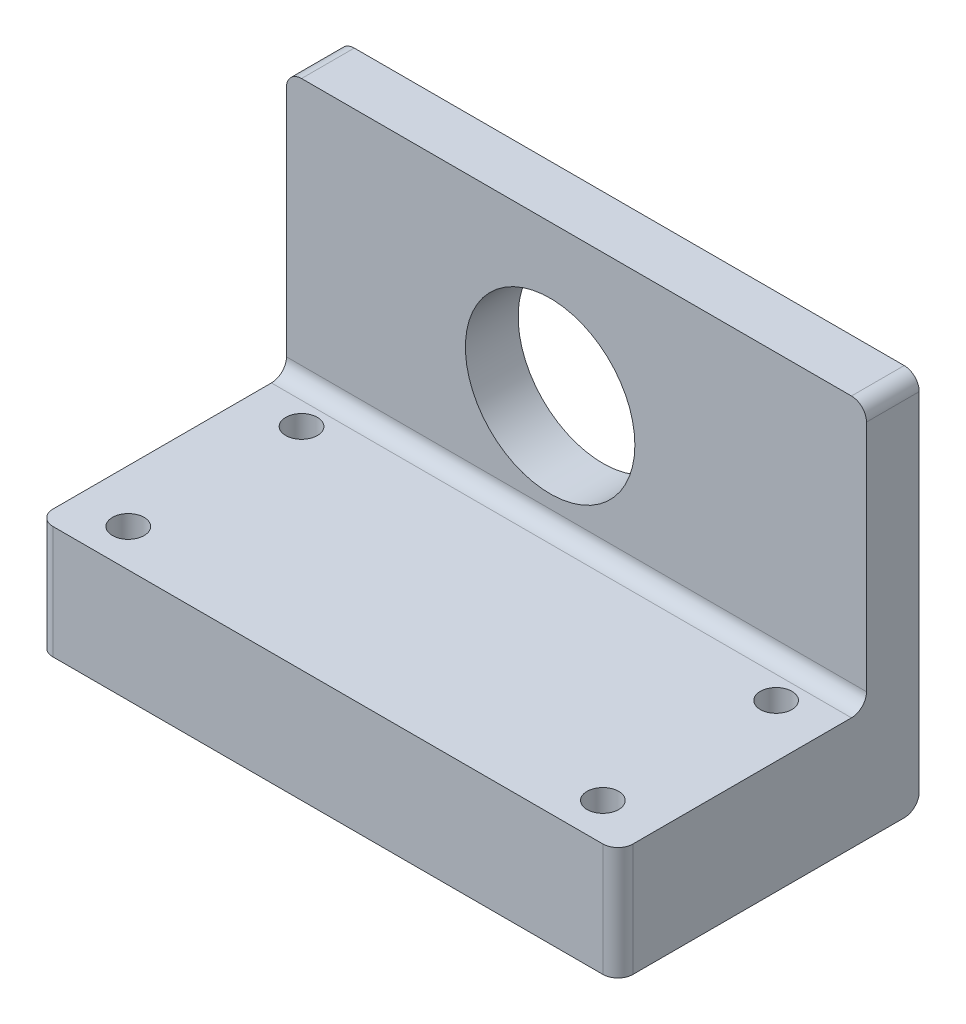
ISO-10303-21;
HEADER;
FILE_DESCRIPTION(('STEP AP214'),'2;1');
FILE_NAME('part.step','',(''),(''),'','','');
FILE_SCHEMA(('AUTOMOTIVE_DESIGN { 1 0 10303 214 1 1 1 1 }'));
ENDSEC;
DATA;
#1=APPLICATION_CONTEXT('core data for automotive mechanical design processes');
#2=APPLICATION_PROTOCOL_DEFINITION('international standard','automotive_design',2000,#1);
#3=PRODUCT_CONTEXT('',#1,'mechanical');
#4=PRODUCT('Part','Part','',(#3));
#5=PRODUCT_RELATED_PRODUCT_CATEGORY('part','',(#4));
#6=PRODUCT_DEFINITION_FORMATION('','',#4);
#7=PRODUCT_DEFINITION_CONTEXT('part definition',#1,'design');
#8=PRODUCT_DEFINITION('design','',#6,#7);
#9=PRODUCT_DEFINITION_SHAPE('','',#8);
#10=(LENGTH_UNIT() NAMED_UNIT(*) SI_UNIT(.MILLI.,.METRE.));
#11=(NAMED_UNIT(*) PLANE_ANGLE_UNIT() SI_UNIT($,.RADIAN.));
#12=(NAMED_UNIT(*) SI_UNIT($,.STERADIAN.) SOLID_ANGLE_UNIT());
#13=UNCERTAINTY_MEASURE_WITH_UNIT(LENGTH_MEASURE(1.E-05),#10,'distance_accuracy_value','');
#14=(GEOMETRIC_REPRESENTATION_CONTEXT(3) GLOBAL_UNCERTAINTY_ASSIGNED_CONTEXT((#13)) GLOBAL_UNIT_ASSIGNED_CONTEXT((#10,
#11,#12)) REPRESENTATION_CONTEXT('',''));
#15=CARTESIAN_POINT('',(0.,0.,0.));
#16=DIRECTION('',(0.,0.,1.));
#17=DIRECTION('',(1.,0.,0.));
#18=AXIS2_PLACEMENT_3D('',#15,#16,#17);
#19=CARTESIAN_POINT('',(-35.,17.5,7.));
#20=DIRECTION('',(1.,0.,0.));
#21=DIRECTION('',(0.,1.,0.));
#22=AXIS2_PLACEMENT_3D('',#19,#20,#21);
#23=PLANE('',#22);
#24=DIRECTION('',(0.,-1.,0.));
#25=VECTOR('',#24,1.);
#26=CARTESIAN_POINT('',(-35.,17.5,0.));
#27=LINE('',#26,#25);
#28=CARTESIAN_POINT('',(-35.,15.5,0.));
#29=VERTEX_POINT('',#28);
#30=CARTESIAN_POINT('',(-35.,-30.5,0.));
#31=VERTEX_POINT('',#30);
#32=EDGE_CURVE('E204',#29,#31,#27,.T.);
#33=ORIENTED_EDGE('',*,*,#32,.T.);
#34=CARTESIAN_POINT('',(-35.,-30.5,2.));
#35=DIRECTION('',(1.,0.,0.));
#36=DIRECTION('',(0.,1.,0.));
#37=AXIS2_PLACEMENT_3D('',#34,#35,#36);
#38=CIRCLE('',#37,2.);
#39=CARTESIAN_POINT('',(-35.,-32.5,2.));
#40=VERTEX_POINT('',#39);
#41=EDGE_CURVE('E167',#31,#40,#38,.F.);
#42=ORIENTED_EDGE('',*,*,#41,.T.);
#43=DIRECTION('',(0.,0.,-1.));
#44=VECTOR('',#43,1.);
#45=CARTESIAN_POINT('',(-35.,-32.5,40.));
#46=LINE('',#45,#44);
#47=CARTESIAN_POINT('',(-35.,-32.5,38.));
#48=VERTEX_POINT('',#47);
#49=EDGE_CURVE('E241',#48,#40,#46,.T.);
#50=ORIENTED_EDGE('',*,*,#49,.F.);
#51=DIRECTION('',(0.,1.,0.));
#52=VECTOR('',#51,1.);
#53=CARTESIAN_POINT('',(-35.,17.5,38.));
#54=LINE('',#53,#52);
#55=CARTESIAN_POINT('',(-35.,-17.5,38.));
#56=VERTEX_POINT('',#55);
#57=EDGE_CURVE('E165',#48,#56,#54,.T.);
#58=ORIENTED_EDGE('',*,*,#57,.T.);
#59=DIRECTION('',(0.,0.,-1.));
#60=VECTOR('',#59,1.);
#61=CARTESIAN_POINT('',(-35.,-17.5,40.));
#62=LINE('',#61,#60);
#63=CARTESIAN_POINT('',(-35.,-17.5,9.));
#64=VERTEX_POINT('',#63);
#65=EDGE_CURVE('E138',#56,#64,#62,.T.);
#66=ORIENTED_EDGE('',*,*,#65,.T.);
#67=CARTESIAN_POINT('',(-35.,-15.5,9.));
#68=DIRECTION('',(1.,0.,0.));
#69=DIRECTION('',(0.,1.,0.));
#70=AXIS2_PLACEMENT_3D('',#67,#68,#69);
#71=CIRCLE('',#70,2.);
#72=CARTESIAN_POINT('',(-35.,-15.5,7.));
#73=VERTEX_POINT('',#72);
#74=EDGE_CURVE('E134',#64,#73,#71,.T.);
#75=ORIENTED_EDGE('',*,*,#74,.T.);
#76=DIRECTION('',(0.,-1.,0.));
#77=VECTOR('',#76,1.);
#78=CARTESIAN_POINT('',(-35.,17.5,7.));
#79=LINE('',#78,#77);
#80=CARTESIAN_POINT('',(-35.,15.5,7.));
#81=VERTEX_POINT('',#80);
#82=EDGE_CURVE('E120',#81,#73,#79,.T.);
#83=ORIENTED_EDGE('',*,*,#82,.F.);
#84=DIRECTION('',(0.,0.,-1.));
#85=VECTOR('',#84,1.);
#86=CARTESIAN_POINT('',(-35.,15.5,7.));
#87=LINE('',#86,#85);
#88=EDGE_CURVE('E163',#81,#29,#87,.T.);
#89=ORIENTED_EDGE('',*,*,#88,.T.);
#90=EDGE_LOOP('',(#33,#42,#50,#58,#66,#75,#83,#89));
#91=FACE_BOUND('',#90,.T.);
#92=ADVANCED_FACE('F32',(#91),#23,.F.);
#93=CARTESIAN_POINT('',(42.,17.5,7.));
#94=DIRECTION('',(-1.,0.,0.));
#95=DIRECTION('',(0.,-1.,0.));
#96=AXIS2_PLACEMENT_3D('',#93,#94,#95);
#97=PLANE('',#96);
#98=DIRECTION('',(0.,0.,-1.));
#99=VECTOR('',#98,1.);
#100=CARTESIAN_POINT('',(42.,-32.5,40.));
#101=LINE('',#100,#99);
#102=CARTESIAN_POINT('',(42.,-32.5,38.));
#103=VERTEX_POINT('',#102);
#104=CARTESIAN_POINT('',(42.,-32.5,2.));
#105=VERTEX_POINT('',#104);
#106=EDGE_CURVE('E233',#103,#105,#101,.T.);
#107=ORIENTED_EDGE('',*,*,#106,.T.);
#108=CARTESIAN_POINT('',(42.,-30.5,2.));
#109=DIRECTION('',(-1.,0.,0.));
#110=DIRECTION('',(0.,-1.,0.));
#111=AXIS2_PLACEMENT_3D('',#108,#109,#110);
#112=CIRCLE('',#111,2.);
#113=CARTESIAN_POINT('',(42.,-30.5,0.));
#114=VERTEX_POINT('',#113);
#115=EDGE_CURVE('E180',#105,#114,#112,.F.);
#116=ORIENTED_EDGE('',*,*,#115,.T.);
#117=DIRECTION('',(0.,1.,0.));
#118=VECTOR('',#117,1.);
#119=CARTESIAN_POINT('',(42.,17.5,0.));
#120=LINE('',#119,#118);
#121=CARTESIAN_POINT('',(42.,15.5,0.));
#122=VERTEX_POINT('',#121);
#123=EDGE_CURVE('E202',#114,#122,#120,.T.);
#124=ORIENTED_EDGE('',*,*,#123,.T.);
#125=DIRECTION('',(0.,0.,-1.));
#126=VECTOR('',#125,1.);
#127=CARTESIAN_POINT('',(42.,15.5,7.));
#128=LINE('',#127,#126);
#129=CARTESIAN_POINT('',(42.,15.5,7.));
#130=VERTEX_POINT('',#129);
#131=EDGE_CURVE('E175',#122,#130,#128,.F.);
#132=ORIENTED_EDGE('',*,*,#131,.T.);
#133=DIRECTION('',(0.,1.,0.));
#134=VECTOR('',#133,1.);
#135=CARTESIAN_POINT('',(42.,17.5,7.));
#136=LINE('',#135,#134);
#137=CARTESIAN_POINT('',(42.,-15.5,7.));
#138=VERTEX_POINT('',#137);
#139=EDGE_CURVE('E130',#138,#130,#136,.T.);
#140=ORIENTED_EDGE('',*,*,#139,.F.);
#141=CARTESIAN_POINT('',(42.,-15.5,9.));
#142=DIRECTION('',(-1.,0.,0.));
#143=DIRECTION('',(0.,-1.,0.));
#144=AXIS2_PLACEMENT_3D('',#141,#142,#143);
#145=CIRCLE('',#144,2.);
#146=CARTESIAN_POINT('',(42.,-17.5,9.));
#147=VERTEX_POINT('',#146);
#148=EDGE_CURVE('E143',#138,#147,#145,.T.);
#149=ORIENTED_EDGE('',*,*,#148,.T.);
#150=DIRECTION('',(0.,0.,-1.));
#151=VECTOR('',#150,1.);
#152=CARTESIAN_POINT('',(42.,-17.5,40.));
#153=LINE('',#152,#151);
#154=CARTESIAN_POINT('',(42.,-17.5,38.));
#155=VERTEX_POINT('',#154);
#156=EDGE_CURVE('E238',#155,#147,#153,.T.);
#157=ORIENTED_EDGE('',*,*,#156,.F.);
#158=DIRECTION('',(0.,-1.,0.));
#159=VECTOR('',#158,1.);
#160=CARTESIAN_POINT('',(42.,17.5,38.));
#161=LINE('',#160,#159);
#162=EDGE_CURVE('E177',#155,#103,#161,.T.);
#163=ORIENTED_EDGE('',*,*,#162,.T.);
#164=EDGE_LOOP('',(#107,#116,#124,#132,#140,#149,#157,#163));
#165=FACE_BOUND('',#164,.T.);
#166=ADVANCED_FACE('F257',(#165),#97,.F.);
#167=CARTESIAN_POINT('',(-35.,17.5,7.));
#168=DIRECTION('',(0.,-1.,0.));
#169=DIRECTION('',(0.,0.,-1.));
#170=AXIS2_PLACEMENT_3D('',#167,#168,#169);
#171=PLANE('',#170);
#172=DIRECTION('',(-1.,0.,0.));
#173=VECTOR('',#172,1.);
#174=CARTESIAN_POINT('',(-35.,17.5,0.));
#175=LINE('',#174,#173);
#176=CARTESIAN_POINT('',(40.,17.5,0.));
#177=VERTEX_POINT('',#176);
#178=CARTESIAN_POINT('',(-33.,17.5,0.));
#179=VERTEX_POINT('',#178);
#180=EDGE_CURVE('E131',#177,#179,#175,.T.);
#181=ORIENTED_EDGE('',*,*,#180,.T.);
#182=DIRECTION('',(0.,0.,-1.));
#183=VECTOR('',#182,1.);
#184=CARTESIAN_POINT('',(-33.,17.5,7.));
#185=LINE('',#184,#183);
#186=CARTESIAN_POINT('',(-33.,17.5,7.));
#187=VERTEX_POINT('',#186);
#188=EDGE_CURVE('E47',#179,#187,#185,.F.);
#189=ORIENTED_EDGE('',*,*,#188,.T.);
#190=DIRECTION('',(-1.,0.,0.));
#191=VECTOR('',#190,1.);
#192=CARTESIAN_POINT('',(-35.,17.5,7.));
#193=LINE('',#192,#191);
#194=CARTESIAN_POINT('',(40.,17.5,7.));
#195=VERTEX_POINT('',#194);
#196=EDGE_CURVE('E148',#195,#187,#193,.T.);
#197=ORIENTED_EDGE('',*,*,#196,.F.);
#198=DIRECTION('',(0.,0.,-1.));
#199=VECTOR('',#198,1.);
#200=CARTESIAN_POINT('',(40.,17.5,7.));
#201=LINE('',#200,#199);
#202=EDGE_CURVE('E190',#195,#177,#201,.T.);
#203=ORIENTED_EDGE('',*,*,#202,.T.);
#204=EDGE_LOOP('',(#181,#189,#197,#203));
#205=FACE_BOUND('',#204,.T.);
#206=ADVANCED_FACE('F195',(#205),#171,.F.);
#207=CARTESIAN_POINT('',(0.,0.,7.));
#208=DIRECTION('',(0.,0.,1.));
#209=DIRECTION('',(1.,0.,0.));
#210=AXIS2_PLACEMENT_3D('',#207,#208,#209);
#211=PLANE('',#210);
#212=CARTESIAN_POINT('',(0.,-2.5,7.));
#213=DIRECTION('',(0.,0.,1.));
#214=DIRECTION('',(1.,0.,0.));
#215=AXIS2_PLACEMENT_3D('',#212,#213,#214);
#216=CIRCLE('',#215,11.25);
#217=CARTESIAN_POINT('',(11.25,-2.5,7.));
#218=VERTEX_POINT('',#217);
#219=EDGE_CURVE('E211',#218,#218,#216,.T.);
#220=ORIENTED_EDGE('',*,*,#219,.F.);
#221=EDGE_LOOP('',(#220));
#222=FACE_BOUND('',#221,.T.);
#223=ORIENTED_EDGE('',*,*,#196,.T.);
#224=CARTESIAN_POINT('',(-33.,15.5,7.));
#225=DIRECTION('',(0.,0.,1.));
#226=DIRECTION('',(1.,0.,0.));
#227=AXIS2_PLACEMENT_3D('',#224,#225,#226);
#228=CIRCLE('',#227,2.);
#229=EDGE_CURVE('E11',#187,#81,#228,.T.);
#230=ORIENTED_EDGE('',*,*,#229,.T.);
#231=ORIENTED_EDGE('',*,*,#82,.T.);
#232=DIRECTION('',(1.,0.,0.));
#233=VECTOR('',#232,1.);
#234=CARTESIAN_POINT('',(42.,-15.5,7.));
#235=LINE('',#234,#233);
#236=EDGE_CURVE('E124',#73,#138,#235,.T.);
#237=ORIENTED_EDGE('',*,*,#236,.T.);
#238=ORIENTED_EDGE('',*,*,#139,.T.);
#239=CARTESIAN_POINT('',(40.,15.5,7.));
#240=DIRECTION('',(0.,0.,1.));
#241=DIRECTION('',(1.,0.,0.));
#242=AXIS2_PLACEMENT_3D('',#239,#240,#241);
#243=CIRCLE('',#242,2.);
#244=EDGE_CURVE('E40',#130,#195,#243,.T.);
#245=ORIENTED_EDGE('',*,*,#244,.T.);
#246=EDGE_LOOP('',(#223,#230,#231,#237,#238,#245));
#247=FACE_BOUND('',#246,.T.);
#248=ADVANCED_FACE('F122',(#222,#247),#211,.T.);
#249=CARTESIAN_POINT('',(0.,0.,0.));
#250=DIRECTION('',(0.,0.,1.));
#251=DIRECTION('',(1.,0.,0.));
#252=AXIS2_PLACEMENT_3D('',#249,#250,#251);
#253=PLANE('',#252);
#254=CARTESIAN_POINT('',(0.,-2.5,0.));
#255=DIRECTION('',(0.,0.,1.));
#256=DIRECTION('',(1.,0.,0.));
#257=AXIS2_PLACEMENT_3D('',#254,#255,#256);
#258=CIRCLE('',#257,11.25);
#259=CARTESIAN_POINT('',(11.25,-2.5,0.));
#260=VERTEX_POINT('',#259);
#261=EDGE_CURVE('E208',#260,#260,#258,.T.);
#262=ORIENTED_EDGE('',*,*,#261,.T.);
#263=EDGE_LOOP('',(#262));
#264=FACE_BOUND('',#263,.T.);
#265=ORIENTED_EDGE('',*,*,#123,.F.);
#266=DIRECTION('',(-1.,0.,0.));
#267=VECTOR('',#266,1.);
#268=CARTESIAN_POINT('',(-35.,-30.5,0.));
#269=LINE('',#268,#267);
#270=EDGE_CURVE('E160',#114,#31,#269,.T.);
#271=ORIENTED_EDGE('',*,*,#270,.T.);
#272=ORIENTED_EDGE('',*,*,#32,.F.);
#273=CARTESIAN_POINT('',(-33.,15.5,0.));
#274=DIRECTION('',(0.,0.,1.));
#275=DIRECTION('',(1.,0.,0.));
#276=AXIS2_PLACEMENT_3D('',#273,#274,#275);
#277=CIRCLE('',#276,2.);
#278=EDGE_CURVE('E158',#29,#179,#277,.F.);
#279=ORIENTED_EDGE('',*,*,#278,.T.);
#280=ORIENTED_EDGE('',*,*,#180,.F.);
#281=CARTESIAN_POINT('',(40.,15.5,0.));
#282=DIRECTION('',(0.,0.,1.));
#283=DIRECTION('',(1.,0.,0.));
#284=AXIS2_PLACEMENT_3D('',#281,#282,#283);
#285=CIRCLE('',#284,2.);
#286=EDGE_CURVE('E142',#177,#122,#285,.F.);
#287=ORIENTED_EDGE('',*,*,#286,.T.);
#288=EDGE_LOOP('',(#265,#271,#272,#279,#280,#287));
#289=FACE_BOUND('',#288,.T.);
#290=ADVANCED_FACE('F199',(#264,#289),#253,.F.);
#291=CARTESIAN_POINT('',(0.,-2.5,-8.));
#292=DIRECTION('',(0.,0.,1.));
#293=DIRECTION('',(1.,0.,0.));
#294=AXIS2_PLACEMENT_3D('',#291,#292,#293);
#295=CYLINDRICAL_SURFACE('',#294,11.25);
#296=CARTESIAN_POINT('',(11.25,-2.5,7.));
#297=CARTESIAN_POINT('',(11.25,-2.5,6.92708333333333));
#298=CARTESIAN_POINT('',(11.25,-2.5,6.85416666666667));
#299=CARTESIAN_POINT('',(11.25,-2.5,6.70833333333333));
#300=CARTESIAN_POINT('',(11.25,-2.5,6.63541666666667));
#301=CARTESIAN_POINT('',(11.25,-2.5,6.48958333333333));
#302=CARTESIAN_POINT('',(11.25,-2.5,6.41666666666667));
#303=CARTESIAN_POINT('',(11.25,-2.5,6.27083333333333));
#304=CARTESIAN_POINT('',(11.25,-2.5,6.19791666666667));
#305=CARTESIAN_POINT('',(11.25,-2.5,6.05208333333333));
#306=CARTESIAN_POINT('',(11.25,-2.5,5.97916666666667));
#307=CARTESIAN_POINT('',(11.25,-2.5,5.83333333333333));
#308=CARTESIAN_POINT('',(11.25,-2.5,5.76041666666667));
#309=CARTESIAN_POINT('',(11.25,-2.5,5.61458333333333));
#310=CARTESIAN_POINT('',(11.25,-2.5,5.54166666666667));
#311=CARTESIAN_POINT('',(11.25,-2.5,5.39583333333333));
#312=CARTESIAN_POINT('',(11.25,-2.5,5.32291666666667));
#313=CARTESIAN_POINT('',(11.25,-2.5,5.17708333333333));
#314=CARTESIAN_POINT('',(11.25,-2.5,5.10416666666667));
#315=CARTESIAN_POINT('',(11.25,-2.5,4.95833333333333));
#316=CARTESIAN_POINT('',(11.25,-2.5,4.88541666666667));
#317=CARTESIAN_POINT('',(11.25,-2.5,4.73958333333333));
#318=CARTESIAN_POINT('',(11.25,-2.5,4.66666666666667));
#319=CARTESIAN_POINT('',(11.25,-2.5,4.52083333333333));
#320=CARTESIAN_POINT('',(11.25,-2.5,4.44791666666667));
#321=CARTESIAN_POINT('',(11.25,-2.5,4.30208333333333));
#322=CARTESIAN_POINT('',(11.25,-2.5,4.22916666666667));
#323=CARTESIAN_POINT('',(11.25,-2.5,4.08333333333333));
#324=CARTESIAN_POINT('',(11.25,-2.5,4.01041666666667));
#325=CARTESIAN_POINT('',(11.25,-2.5,3.86458333333333));
#326=CARTESIAN_POINT('',(11.25,-2.5,3.79166666666667));
#327=CARTESIAN_POINT('',(11.25,-2.5,3.64583333333333));
#328=CARTESIAN_POINT('',(11.25,-2.5,3.57291666666667));
#329=CARTESIAN_POINT('',(11.25,-2.5,3.42708333333333));
#330=CARTESIAN_POINT('',(11.25,-2.5,3.35416666666667));
#331=CARTESIAN_POINT('',(11.25,-2.5,3.20833333333333));
#332=CARTESIAN_POINT('',(11.25,-2.5,3.13541666666667));
#333=CARTESIAN_POINT('',(11.25,-2.5,2.98958333333333));
#334=CARTESIAN_POINT('',(11.25,-2.5,2.91666666666667));
#335=CARTESIAN_POINT('',(11.25,-2.5,2.77083333333333));
#336=CARTESIAN_POINT('',(11.25,-2.5,2.69791666666667));
#337=CARTESIAN_POINT('',(11.25,-2.5,2.55208333333333));
#338=CARTESIAN_POINT('',(11.25,-2.5,2.47916666666667));
#339=CARTESIAN_POINT('',(11.25,-2.5,2.33333333333333));
#340=CARTESIAN_POINT('',(11.25,-2.5,2.26041666666667));
#341=CARTESIAN_POINT('',(11.25,-2.5,2.11458333333333));
#342=CARTESIAN_POINT('',(11.25,-2.5,2.04166666666667));
#343=CARTESIAN_POINT('',(11.25,-2.5,1.89583333333333));
#344=CARTESIAN_POINT('',(11.25,-2.5,1.82291666666667));
#345=CARTESIAN_POINT('',(11.25,-2.5,1.67708333333333));
#346=CARTESIAN_POINT('',(11.25,-2.5,1.60416666666667));
#347=CARTESIAN_POINT('',(11.25,-2.5,1.45833333333333));
#348=CARTESIAN_POINT('',(11.25,-2.5,1.38541666666667));
#349=CARTESIAN_POINT('',(11.25,-2.5,1.23958333333333));
#350=CARTESIAN_POINT('',(11.25,-2.5,1.16666666666667));
#351=CARTESIAN_POINT('',(11.25,-2.5,1.02083333333333));
#352=CARTESIAN_POINT('',(11.25,-2.5,0.947916666666666));
#353=CARTESIAN_POINT('',(11.25,-2.5,0.802083333333332));
#354=CARTESIAN_POINT('',(11.25,-2.5,0.729166666666666));
#355=CARTESIAN_POINT('',(11.25,-2.5,0.583333333333332));
#356=CARTESIAN_POINT('',(11.25,-2.5,0.510416666666665));
#357=CARTESIAN_POINT('',(11.25,-2.5,0.364583333333332));
#358=CARTESIAN_POINT('',(11.25,-2.5,0.291666666666665));
#359=CARTESIAN_POINT('',(11.25,-2.5,0.145833333333332));
#360=CARTESIAN_POINT('',(11.25,-2.5,0.0729166666666649));
#361=CARTESIAN_POINT('',(11.25,-2.5,0.));
#362=B_SPLINE_CURVE_WITH_KNOTS('',3,(#296,#297,#298,#299,#300,#301,#302,#303,#304,#305,#306,
#307,#308,#309,#310,#311,#312,#313,#314,#315,#316,#317,#318,#319,#320,#321,#322,#323,#324,#325,
#326,#327,#328,#329,#330,#331,#332,#333,#334,#335,#336,#337,#338,#339,#340,#341,#342,#343,#344,
#345,#346,#347,#348,#349,#350,#351,#352,#353,#354,#355,#356,#357,#358,#359,#360,#361),
.UNSPECIFIED.,.F.,.F.,(4,2,2,2,2,2,2,2,2,2,2,2,2,2,2,2,2,2,2,2,2,2,2,2,2,2,2,2,2,2,2,2,4),(0.,
0.21875,0.4375,0.656250000000001,0.875000000000001,1.09375,1.3125,1.53125,1.75,1.96875,2.1875,
2.40625,2.625,2.84375,3.0625,3.28125,3.5,3.71875,3.9375,4.15625,4.375,4.59375,4.8125,5.03125,
5.25,5.46875,5.6875,5.90625,6.125,6.34375,6.5625,6.78125,7.),.UNSPECIFIED.);
#363=EDGE_CURVE('BSEAM383',#218,#260,#362,.T.);
#364=ORIENTED_EDGE('',*,*,#219,.T.);
#365=ORIENTED_EDGE('',*,*,#261,.F.);
#366=ORIENTED_EDGE('',*,*,#363,.T.);
#367=ORIENTED_EDGE('',*,*,#363,.F.);
#368=EDGE_LOOP('',(#364,#366,#365,#367));
#369=FACE_BOUND('',#368,.T.);
#370=ADVANCED_FACE('F383',(#369),#295,.F.);
#371=CARTESIAN_POINT('',(42.,-17.5,40.));
#372=DIRECTION('',(0.,1.,0.));
#373=DIRECTION('',(0.,0.,1.));
#374=AXIS2_PLACEMENT_3D('',#371,#372,#373);
#375=PLANE('',#374);
#376=CARTESIAN_POINT('',(-28.,-17.5,12.));
#377=DIRECTION('',(0.,1.,0.));
#378=DIRECTION('',(-1.,0.,0.));
#379=AXIS2_PLACEMENT_3D('',#376,#377,#378);
#380=CIRCLE('',#379,2.1);
#381=CARTESIAN_POINT('',(-30.1,-17.5,12.));
#382=VERTEX_POINT('',#381);
#383=EDGE_CURVE('E453',#382,#382,#380,.T.);
#384=ORIENTED_EDGE('',*,*,#383,.F.);
#385=EDGE_LOOP('',(#384));
#386=FACE_BOUND('',#385,.T.);
#387=CARTESIAN_POINT('',(35.,-17.5,35.));
#388=DIRECTION('',(0.,1.,0.));
#389=DIRECTION('',(-1.,0.,0.));
#390=AXIS2_PLACEMENT_3D('',#387,#388,#389);
#391=CIRCLE('',#390,2.1);
#392=CARTESIAN_POINT('',(32.9,-17.5,35.));
#393=VERTEX_POINT('',#392);
#394=EDGE_CURVE('E457',#393,#393,#391,.T.);
#395=ORIENTED_EDGE('',*,*,#394,.F.);
#396=EDGE_LOOP('',(#395));
#397=FACE_BOUND('',#396,.T.);
#398=CARTESIAN_POINT('',(35.,-17.5,12.));
#399=DIRECTION('',(0.,1.,0.));
#400=DIRECTION('',(-1.,0.,0.));
#401=AXIS2_PLACEMENT_3D('',#398,#399,#400);
#402=CIRCLE('',#401,2.1);
#403=CARTESIAN_POINT('',(32.9,-17.5,12.));
#404=VERTEX_POINT('',#403);
#405=EDGE_CURVE('E461',#404,#404,#402,.T.);
#406=ORIENTED_EDGE('',*,*,#405,.F.);
#407=EDGE_LOOP('',(#406));
#408=FACE_BOUND('',#407,.T.);
#409=CARTESIAN_POINT('',(-28.,-17.5,35.));
#410=DIRECTION('',(0.,1.,0.));
#411=DIRECTION('',(-1.,0.,0.));
#412=AXIS2_PLACEMENT_3D('',#409,#410,#411);
#413=CIRCLE('',#412,2.1);
#414=CARTESIAN_POINT('',(-30.1,-17.5,35.));
#415=VERTEX_POINT('',#414);
#416=EDGE_CURVE('E216',#415,#415,#413,.T.);
#417=ORIENTED_EDGE('',*,*,#416,.F.);
#418=EDGE_LOOP('',(#417));
#419=FACE_BOUND('',#418,.T.);
#420=DIRECTION('',(1.,0.,0.));
#421=VECTOR('',#420,1.);
#422=CARTESIAN_POINT('',(42.,-17.5,40.));
#423=LINE('',#422,#421);
#424=CARTESIAN_POINT('',(-33.,-17.5,40.));
#425=VERTEX_POINT('',#424);
#426=CARTESIAN_POINT('',(40.,-17.5,40.));
#427=VERTEX_POINT('',#426);
#428=EDGE_CURVE('E227',#425,#427,#423,.T.);
#429=ORIENTED_EDGE('',*,*,#428,.T.);
#430=CARTESIAN_POINT('',(40.,-17.5,38.));
#431=DIRECTION('',(0.,1.,0.));
#432=DIRECTION('',(0.,0.,1.));
#433=AXIS2_PLACEMENT_3D('',#430,#431,#432);
#434=CIRCLE('',#433,2.);
#435=EDGE_CURVE('E188',#427,#155,#434,.T.);
#436=ORIENTED_EDGE('',*,*,#435,.T.);
#437=ORIENTED_EDGE('',*,*,#156,.T.);
#438=DIRECTION('',(1.,0.,0.));
#439=VECTOR('',#438,1.);
#440=CARTESIAN_POINT('',(-35.,-17.5,9.));
#441=LINE('',#440,#439);
#442=EDGE_CURVE('E147',#147,#64,#441,.F.);
#443=ORIENTED_EDGE('',*,*,#442,.T.);
#444=ORIENTED_EDGE('',*,*,#65,.F.);
#445=CARTESIAN_POINT('',(-33.,-17.5,38.));
#446=DIRECTION('',(0.,1.,0.));
#447=DIRECTION('',(0.,0.,1.));
#448=AXIS2_PLACEMENT_3D('',#445,#446,#447);
#449=CIRCLE('',#448,2.);
#450=EDGE_CURVE('E186',#56,#425,#449,.T.);
#451=ORIENTED_EDGE('',*,*,#450,.T.);
#452=EDGE_LOOP('',(#429,#436,#437,#443,#444,#451));
#453=FACE_BOUND('',#452,.T.);
#454=ADVANCED_FACE('F272',(#386,#397,#408,#419,#453),#375,.T.);
#455=CARTESIAN_POINT('',(42.,-32.5,40.));
#456=DIRECTION('',(0.,-1.,0.));
#457=DIRECTION('',(0.,0.,-1.));
#458=AXIS2_PLACEMENT_3D('',#455,#456,#457);
#459=PLANE('',#458);
#460=CARTESIAN_POINT('',(-28.,-32.5,12.));
#461=DIRECTION('',(0.,-1.,0.));
#462=DIRECTION('',(0.,0.,-1.));
#463=AXIS2_PLACEMENT_3D('',#460,#461,#462);
#464=CIRCLE('',#463,2.1);
#465=CARTESIAN_POINT('',(-28.,-32.5,9.9));
#466=VERTEX_POINT('',#465);
#467=EDGE_CURVE('E153',#466,#466,#464,.T.);
#468=ORIENTED_EDGE('',*,*,#467,.F.);
#469=EDGE_LOOP('',(#468));
#470=FACE_BOUND('',#469,.T.);
#471=CARTESIAN_POINT('',(35.,-32.5,35.));
#472=DIRECTION('',(0.,-1.,0.));
#473=DIRECTION('',(0.,0.,-1.));
#474=AXIS2_PLACEMENT_3D('',#471,#472,#473);
#475=CIRCLE('',#474,2.1);
#476=CARTESIAN_POINT('',(35.,-32.5,32.9));
#477=VERTEX_POINT('',#476);
#478=EDGE_CURVE('E218',#477,#477,#475,.T.);
#479=ORIENTED_EDGE('',*,*,#478,.F.);
#480=EDGE_LOOP('',(#479));
#481=FACE_BOUND('',#480,.T.);
#482=CARTESIAN_POINT('',(35.,-32.5,12.));
#483=DIRECTION('',(0.,-1.,0.));
#484=DIRECTION('',(0.,0.,-1.));
#485=AXIS2_PLACEMENT_3D('',#482,#483,#484);
#486=CIRCLE('',#485,2.1);
#487=CARTESIAN_POINT('',(35.,-32.5,9.9));
#488=VERTEX_POINT('',#487);
#489=EDGE_CURVE('E215',#488,#488,#486,.T.);
#490=ORIENTED_EDGE('',*,*,#489,.F.);
#491=EDGE_LOOP('',(#490));
#492=FACE_BOUND('',#491,.T.);
#493=CARTESIAN_POINT('',(-28.,-32.5,35.));
#494=DIRECTION('',(0.,-1.,0.));
#495=DIRECTION('',(0.,0.,-1.));
#496=AXIS2_PLACEMENT_3D('',#493,#494,#495);
#497=CIRCLE('',#496,2.1);
#498=CARTESIAN_POINT('',(-28.,-32.5,32.9));
#499=VERTEX_POINT('',#498);
#500=EDGE_CURVE('E212',#499,#499,#497,.T.);
#501=ORIENTED_EDGE('',*,*,#500,.F.);
#502=EDGE_LOOP('',(#501));
#503=FACE_BOUND('',#502,.T.);
#504=ORIENTED_EDGE('',*,*,#49,.T.);
#505=DIRECTION('',(-1.,0.,0.));
#506=VECTOR('',#505,1.);
#507=CARTESIAN_POINT('',(42.,-32.5,2.));
#508=LINE('',#507,#506);
#509=EDGE_CURVE('E173',#40,#105,#508,.F.);
#510=ORIENTED_EDGE('',*,*,#509,.T.);
#511=ORIENTED_EDGE('',*,*,#106,.F.);
#512=CARTESIAN_POINT('',(40.,-32.5,38.));
#513=DIRECTION('',(0.,-1.,0.));
#514=DIRECTION('',(0.,0.,-1.));
#515=AXIS2_PLACEMENT_3D('',#512,#513,#514);
#516=CIRCLE('',#515,2.);
#517=CARTESIAN_POINT('',(40.,-32.5,40.));
#518=VERTEX_POINT('',#517);
#519=EDGE_CURVE('E171',#103,#518,#516,.T.);
#520=ORIENTED_EDGE('',*,*,#519,.T.);
#521=DIRECTION('',(-1.,0.,0.));
#522=VECTOR('',#521,1.);
#523=CARTESIAN_POINT('',(42.,-32.5,40.));
#524=LINE('',#523,#522);
#525=CARTESIAN_POINT('',(-33.,-32.5,40.));
#526=VERTEX_POINT('',#525);
#527=EDGE_CURVE('E223',#518,#526,#524,.T.);
#528=ORIENTED_EDGE('',*,*,#527,.T.);
#529=CARTESIAN_POINT('',(-33.,-32.5,38.));
#530=DIRECTION('',(0.,-1.,0.));
#531=DIRECTION('',(0.,0.,-1.));
#532=AXIS2_PLACEMENT_3D('',#529,#530,#531);
#533=CIRCLE('',#532,2.);
#534=EDGE_CURVE('E169',#526,#48,#533,.T.);
#535=ORIENTED_EDGE('',*,*,#534,.T.);
#536=EDGE_LOOP('',(#504,#510,#511,#520,#528,#535));
#537=FACE_BOUND('',#536,.T.);
#538=ADVANCED_FACE('F255',(#470,#481,#492,#503,#537),#459,.T.);
#539=CARTESIAN_POINT('',(0.,0.,40.));
#540=DIRECTION('',(0.,0.,-1.));
#541=DIRECTION('',(-1.,0.,0.));
#542=AXIS2_PLACEMENT_3D('',#539,#540,#541);
#543=PLANE('',#542);
#544=ORIENTED_EDGE('',*,*,#527,.F.);
#545=DIRECTION('',(0.,-1.,0.));
#546=VECTOR('',#545,1.);
#547=CARTESIAN_POINT('',(40.,0.,40.));
#548=LINE('',#547,#546);
#549=EDGE_CURVE('E184',#518,#427,#548,.F.);
#550=ORIENTED_EDGE('',*,*,#549,.T.);
#551=ORIENTED_EDGE('',*,*,#428,.F.);
#552=DIRECTION('',(0.,1.,0.));
#553=VECTOR('',#552,1.);
#554=CARTESIAN_POINT('',(-33.,0.,40.));
#555=LINE('',#554,#553);
#556=EDGE_CURVE('E182',#425,#526,#555,.F.);
#557=ORIENTED_EDGE('',*,*,#556,.T.);
#558=EDGE_LOOP('',(#544,#550,#551,#557));
#559=FACE_BOUND('',#558,.T.);
#560=ADVANCED_FACE('F265',(#559),#543,.F.);
#561=CARTESIAN_POINT('',(-28.,-37.5,35.));
#562=DIRECTION('',(0.,1.,0.));
#563=DIRECTION('',(-1.,0.,0.));
#564=AXIS2_PLACEMENT_3D('',#561,#562,#563);
#565=CYLINDRICAL_SURFACE('',#564,2.1);
#566=ORIENTED_EDGE('',*,*,#500,.T.);
#567=EDGE_LOOP('',(#566));
#568=FACE_BOUND('',#567,.T.);
#569=ORIENTED_EDGE('',*,*,#416,.T.);
#570=EDGE_LOOP('',(#569));
#571=FACE_BOUND('',#570,.T.);
#572=ADVANCED_FACE('F351',(#568,#571),#565,.F.);
#573=CARTESIAN_POINT('',(35.,-37.5,12.));
#574=DIRECTION('',(0.,1.,0.));
#575=DIRECTION('',(-1.,0.,0.));
#576=AXIS2_PLACEMENT_3D('',#573,#574,#575);
#577=CYLINDRICAL_SURFACE('',#576,2.1);
#578=ORIENTED_EDGE('',*,*,#489,.T.);
#579=EDGE_LOOP('',(#578));
#580=FACE_BOUND('',#579,.T.);
#581=ORIENTED_EDGE('',*,*,#405,.T.);
#582=EDGE_LOOP('',(#581));
#583=FACE_BOUND('',#582,.T.);
#584=ADVANCED_FACE('F343',(#580,#583),#577,.F.);
#585=CARTESIAN_POINT('',(35.,-37.5,35.));
#586=DIRECTION('',(0.,1.,0.));
#587=DIRECTION('',(-1.,0.,0.));
#588=AXIS2_PLACEMENT_3D('',#585,#586,#587);
#589=CYLINDRICAL_SURFACE('',#588,2.1);
#590=ORIENTED_EDGE('',*,*,#478,.T.);
#591=EDGE_LOOP('',(#590));
#592=FACE_BOUND('',#591,.T.);
#593=ORIENTED_EDGE('',*,*,#394,.T.);
#594=EDGE_LOOP('',(#593));
#595=FACE_BOUND('',#594,.T.);
#596=ADVANCED_FACE('F335',(#592,#595),#589,.F.);
#597=CARTESIAN_POINT('',(-28.,-37.5,12.));
#598=DIRECTION('',(0.,1.,0.));
#599=DIRECTION('',(-1.,0.,0.));
#600=AXIS2_PLACEMENT_3D('',#597,#598,#599);
#601=CYLINDRICAL_SURFACE('',#600,2.1);
#602=ORIENTED_EDGE('',*,*,#467,.T.);
#603=EDGE_LOOP('',(#602));
#604=FACE_BOUND('',#603,.T.);
#605=ORIENTED_EDGE('',*,*,#383,.T.);
#606=EDGE_LOOP('',(#605));
#607=FACE_BOUND('',#606,.T.);
#608=ADVANCED_FACE('F290',(#604,#607),#601,.F.);
#609=CARTESIAN_POINT('',(0.,-15.5,9.));
#610=DIRECTION('',(-1.,0.,0.));
#611=DIRECTION('',(0.,0.,1.));
#612=AXIS2_PLACEMENT_3D('',#609,#610,#611);
#613=CYLINDRICAL_SURFACE('',#612,2.);
#614=ORIENTED_EDGE('',*,*,#74,.F.);
#615=ORIENTED_EDGE('',*,*,#442,.F.);
#616=ORIENTED_EDGE('',*,*,#148,.F.);
#617=ORIENTED_EDGE('',*,*,#236,.F.);
#618=EDGE_LOOP('',(#614,#615,#616,#617));
#619=FACE_BOUND('',#618,.T.);
#620=ADVANCED_FACE('F145',(#619),#613,.F.);
#621=CARTESIAN_POINT('',(0.,-30.5,2.));
#622=DIRECTION('',(1.,0.,0.));
#623=DIRECTION('',(0.,0.,-1.));
#624=AXIS2_PLACEMENT_3D('',#621,#622,#623);
#625=CYLINDRICAL_SURFACE('',#624,2.);
#626=ORIENTED_EDGE('',*,*,#115,.F.);
#627=ORIENTED_EDGE('',*,*,#509,.F.);
#628=ORIENTED_EDGE('',*,*,#41,.F.);
#629=ORIENTED_EDGE('',*,*,#270,.F.);
#630=EDGE_LOOP('',(#626,#627,#628,#629));
#631=FACE_BOUND('',#630,.T.);
#632=ADVANCED_FACE('F252',(#631),#625,.T.);
#633=CARTESIAN_POINT('',(40.,17.5,38.));
#634=DIRECTION('',(0.,-1.,0.));
#635=DIRECTION('',(1.,0.,0.));
#636=AXIS2_PLACEMENT_3D('',#633,#634,#635);
#637=CYLINDRICAL_SURFACE('',#636,2.);
#638=ORIENTED_EDGE('',*,*,#435,.F.);
#639=ORIENTED_EDGE('',*,*,#549,.F.);
#640=ORIENTED_EDGE('',*,*,#519,.F.);
#641=ORIENTED_EDGE('',*,*,#162,.F.);
#642=EDGE_LOOP('',(#638,#639,#640,#641));
#643=FACE_BOUND('',#642,.T.);
#644=ADVANCED_FACE('F262',(#643),#637,.T.);
#645=CARTESIAN_POINT('',(-33.,17.5,38.));
#646=DIRECTION('',(0.,1.,0.));
#647=DIRECTION('',(-1.,0.,0.));
#648=AXIS2_PLACEMENT_3D('',#645,#646,#647);
#649=CYLINDRICAL_SURFACE('',#648,2.);
#650=ORIENTED_EDGE('',*,*,#534,.F.);
#651=ORIENTED_EDGE('',*,*,#556,.F.);
#652=ORIENTED_EDGE('',*,*,#450,.F.);
#653=ORIENTED_EDGE('',*,*,#57,.F.);
#654=EDGE_LOOP('',(#650,#651,#652,#653));
#655=FACE_BOUND('',#654,.T.);
#656=ADVANCED_FACE('F269',(#655),#649,.T.);
#657=CARTESIAN_POINT('',(-33.,15.5,7.));
#658=DIRECTION('',(0.,0.,-1.));
#659=DIRECTION('',(-1.,0.,0.));
#660=AXIS2_PLACEMENT_3D('',#657,#658,#659);
#661=CYLINDRICAL_SURFACE('',#660,2.);
#662=ORIENTED_EDGE('',*,*,#229,.F.);
#663=ORIENTED_EDGE('',*,*,#188,.F.);
#664=ORIENTED_EDGE('',*,*,#278,.F.);
#665=ORIENTED_EDGE('',*,*,#88,.F.);
#666=EDGE_LOOP('',(#662,#663,#664,#665));
#667=FACE_BOUND('',#666,.T.);
#668=ADVANCED_FACE('F275',(#667),#661,.T.);
#669=CARTESIAN_POINT('',(40.,15.5,7.));
#670=DIRECTION('',(0.,0.,-1.));
#671=DIRECTION('',(-1.,0.,0.));
#672=AXIS2_PLACEMENT_3D('',#669,#670,#671);
#673=CYLINDRICAL_SURFACE('',#672,2.);
#674=ORIENTED_EDGE('',*,*,#244,.F.);
#675=ORIENTED_EDGE('',*,*,#131,.F.);
#676=ORIENTED_EDGE('',*,*,#286,.F.);
#677=ORIENTED_EDGE('',*,*,#202,.F.);
#678=EDGE_LOOP('',(#674,#675,#676,#677));
#679=FACE_BOUND('',#678,.T.);
#680=ADVANCED_FACE('F34',(#679),#673,.T.);
#681=CLOSED_SHELL('',(#92,#166,#206,#248,#290,#370,#454,#538,#560,#572,#584,#596,#608,#620,#632,
#644,#656,#668,#680));
#682=MANIFOLD_SOLID_BREP('B2',#681);
#683=ADVANCED_BREP_SHAPE_REPRESENTATION('',(#18,#682),#14);
#684=SHAPE_DEFINITION_REPRESENTATION(#9,#683);
ENDSEC;
END-ISO-10303-21;
